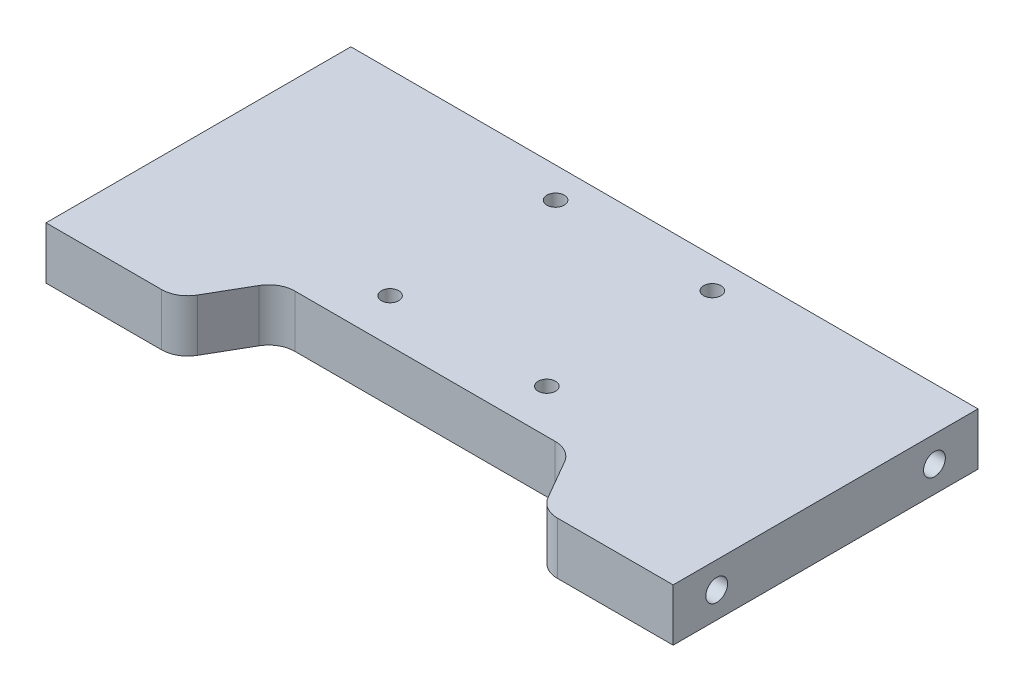
ISO-10303-21;
HEADER;
FILE_DESCRIPTION(('STEP AP214'),'2;1');
FILE_NAME('part.step','',(''),(''),'','','');
FILE_SCHEMA(('AUTOMOTIVE_DESIGN { 1 0 10303 214 1 1 1 1 }'));
ENDSEC;
DATA;
#1=APPLICATION_CONTEXT('core data for automotive mechanical design processes');
#2=APPLICATION_PROTOCOL_DEFINITION('international standard','automotive_design',2000,#1);
#3=PRODUCT_CONTEXT('',#1,'mechanical');
#4=PRODUCT('Part','Part','',(#3));
#5=PRODUCT_RELATED_PRODUCT_CATEGORY('part','',(#4));
#6=PRODUCT_DEFINITION_FORMATION('','',#4);
#7=PRODUCT_DEFINITION_CONTEXT('part definition',#1,'design');
#8=PRODUCT_DEFINITION('design','',#6,#7);
#9=PRODUCT_DEFINITION_SHAPE('','',#8);
#10=(LENGTH_UNIT() NAMED_UNIT(*) SI_UNIT(.MILLI.,.METRE.));
#11=(NAMED_UNIT(*) PLANE_ANGLE_UNIT() SI_UNIT($,.RADIAN.));
#12=(NAMED_UNIT(*) SI_UNIT($,.STERADIAN.) SOLID_ANGLE_UNIT());
#13=UNCERTAINTY_MEASURE_WITH_UNIT(LENGTH_MEASURE(1.E-05),#10,'distance_accuracy_value','');
#14=(GEOMETRIC_REPRESENTATION_CONTEXT(3) GLOBAL_UNCERTAINTY_ASSIGNED_CONTEXT((#13)) GLOBAL_UNIT_ASSIGNED_CONTEXT((#10,
#11,#12)) REPRESENTATION_CONTEXT('',''));
#15=CARTESIAN_POINT('',(0.,0.,0.));
#16=DIRECTION('',(0.,0.,1.));
#17=DIRECTION('',(1.,0.,0.));
#18=AXIS2_PLACEMENT_3D('',#15,#16,#17);
#19=CARTESIAN_POINT('',(0.,6.,0.));
#20=DIRECTION('',(0.,0.,-1.));
#21=DIRECTION('',(-1.,0.,0.));
#22=AXIS2_PLACEMENT_3D('',#19,#20,#21);
#23=PLANE('',#22);
#24=DIRECTION('',(1.,0.,0.));
#25=VECTOR('',#24,1.);
#26=CARTESIAN_POINT('',(0.,0.,0.));
#27=LINE('',#26,#25);
#28=CARTESIAN_POINT('',(0.,0.,0.));
#29=VERTEX_POINT('',#28);
#30=CARTESIAN_POINT('',(13.2679491924311,0.,0.));
#31=VERTEX_POINT('',#30);
#32=EDGE_CURVE('E221',#29,#31,#27,.T.);
#33=ORIENTED_EDGE('',*,*,#32,.T.);
#34=DIRECTION('',(0.,1.,0.));
#35=VECTOR('',#34,1.);
#36=CARTESIAN_POINT('',(13.2679491924311,6.,0.));
#37=LINE('',#36,#35);
#38=CARTESIAN_POINT('',(13.2679491924311,6.,0.));
#39=VERTEX_POINT('',#38);
#40=EDGE_CURVE('E262',#31,#39,#37,.T.);
#41=ORIENTED_EDGE('',*,*,#40,.T.);
#42=DIRECTION('',(1.,0.,0.));
#43=VECTOR('',#42,1.);
#44=CARTESIAN_POINT('',(0.,6.,0.));
#45=LINE('',#44,#43);
#46=CARTESIAN_POINT('',(0.,6.,0.));
#47=VERTEX_POINT('',#46);
#48=EDGE_CURVE('E210',#47,#39,#45,.T.);
#49=ORIENTED_EDGE('',*,*,#48,.F.);
#50=DIRECTION('',(0.,-1.,0.));
#51=VECTOR('',#50,1.);
#52=CARTESIAN_POINT('',(0.,6.,0.));
#53=LINE('',#52,#51);
#54=EDGE_CURVE('E235',#47,#29,#53,.T.);
#55=ORIENTED_EDGE('',*,*,#54,.T.);
#56=EDGE_LOOP('',(#33,#41,#49,#55));
#57=FACE_BOUND('',#56,.T.);
#58=ADVANCED_FACE('F32',(#57),#23,.F.);
#59=CARTESIAN_POINT('',(0.,6.,0.));
#60=DIRECTION('',(1.,0.,0.));
#61=DIRECTION('',(0.,0.,-1.));
#62=AXIS2_PLACEMENT_3D('',#59,#60,#61);
#63=PLANE('',#62);
#64=CARTESIAN_POINT('',(0.,3.,-30.));
#65=DIRECTION('',(-1.,0.,0.));
#66=DIRECTION('',(0.,0.,1.));
#67=AXIS2_PLACEMENT_3D('',#64,#65,#66);
#68=CIRCLE('',#67,1.25);
#69=CARTESIAN_POINT('',(0.,3.,-28.75));
#70=VERTEX_POINT('',#69);
#71=EDGE_CURVE('E153',#70,#70,#68,.T.);
#72=ORIENTED_EDGE('',*,*,#71,.F.);
#73=EDGE_LOOP('',(#72));
#74=FACE_BOUND('',#73,.T.);
#75=CARTESIAN_POINT('',(0.,3.,-5.));
#76=DIRECTION('',(-1.,0.,0.));
#77=DIRECTION('',(0.,0.,1.));
#78=AXIS2_PLACEMENT_3D('',#75,#76,#77);
#79=CIRCLE('',#78,1.25);
#80=CARTESIAN_POINT('',(0.,3.,-3.75));
#81=VERTEX_POINT('',#80);
#82=EDGE_CURVE('E159',#81,#81,#79,.T.);
#83=ORIENTED_EDGE('',*,*,#82,.F.);
#84=EDGE_LOOP('',(#83));
#85=FACE_BOUND('',#84,.T.);
#86=DIRECTION('',(0.,0.,1.));
#87=VECTOR('',#86,1.);
#88=CARTESIAN_POINT('',(0.,0.,0.));
#89=LINE('',#88,#87);
#90=CARTESIAN_POINT('',(0.,0.,-35.));
#91=VERTEX_POINT('',#90);
#92=EDGE_CURVE('E204',#91,#29,#89,.T.);
#93=ORIENTED_EDGE('',*,*,#92,.T.);
#94=ORIENTED_EDGE('',*,*,#54,.F.);
#95=DIRECTION('',(0.,0.,1.));
#96=VECTOR('',#95,1.);
#97=CARTESIAN_POINT('',(0.,6.,0.));
#98=LINE('',#97,#96);
#99=CARTESIAN_POINT('',(0.,6.,-35.));
#100=VERTEX_POINT('',#99);
#101=EDGE_CURVE('E205',#100,#47,#98,.T.);
#102=ORIENTED_EDGE('',*,*,#101,.F.);
#103=DIRECTION('',(0.,-1.,0.));
#104=VECTOR('',#103,1.);
#105=CARTESIAN_POINT('',(0.,6.,-35.));
#106=LINE('',#105,#104);
#107=EDGE_CURVE('E217',#100,#91,#106,.T.);
#108=ORIENTED_EDGE('',*,*,#107,.T.);
#109=EDGE_LOOP('',(#93,#94,#102,#108));
#110=FACE_BOUND('',#109,.T.);
#111=ADVANCED_FACE('F292',(#74,#85,#110),#63,.F.);
#112=CARTESIAN_POINT('',(58.7320508075689,6.,0.));
#113=VERTEX_POINT('',#112);
#114=CARTESIAN_POINT('',(72.,6.,0.));
#115=VERTEX_POINT('',#114);
#116=EDGE_CURVE('E208',#113,#115,#45,.T.);
#117=ORIENTED_EDGE('',*,*,#116,.F.);
#118=DIRECTION('',(0.,1.,0.));
#119=VECTOR('',#118,1.);
#120=CARTESIAN_POINT('',(58.7320508075689,6.,0.));
#121=LINE('',#120,#119);
#122=CARTESIAN_POINT('',(58.7320508075689,0.,0.));
#123=VERTEX_POINT('',#122);
#124=EDGE_CURVE('E247',#113,#123,#121,.F.);
#125=ORIENTED_EDGE('',*,*,#124,.T.);
#126=CARTESIAN_POINT('',(72.,0.,0.));
#127=VERTEX_POINT('',#126);
#128=EDGE_CURVE('E220',#123,#127,#27,.T.);
#129=ORIENTED_EDGE('',*,*,#128,.T.);
#130=DIRECTION('',(0.,-1.,0.));
#131=VECTOR('',#130,1.);
#132=CARTESIAN_POINT('',(72.,6.,0.));
#133=LINE('',#132,#131);
#134=EDGE_CURVE('E232',#115,#127,#133,.T.);
#135=ORIENTED_EDGE('',*,*,#134,.F.);
#136=EDGE_LOOP('',(#117,#125,#129,#135));
#137=FACE_BOUND('',#136,.T.);
#138=ADVANCED_FACE('F306',(#137),#23,.F.);
#139=CARTESIAN_POINT('',(72.,6.,0.));
#140=DIRECTION('',(-1.,0.,0.));
#141=DIRECTION('',(0.,0.,1.));
#142=AXIS2_PLACEMENT_3D('',#139,#140,#141);
#143=PLANE('',#142);
#144=CARTESIAN_POINT('',(72.,3.,-5.));
#145=DIRECTION('',(1.,0.,0.));
#146=DIRECTION('',(0.,0.,-1.));
#147=AXIS2_PLACEMENT_3D('',#144,#145,#146);
#148=CIRCLE('',#147,1.25);
#149=CARTESIAN_POINT('',(72.,3.,-6.25));
#150=VERTEX_POINT('',#149);
#151=EDGE_CURVE('E143',#150,#150,#148,.T.);
#152=ORIENTED_EDGE('',*,*,#151,.F.);
#153=EDGE_LOOP('',(#152));
#154=FACE_BOUND('',#153,.T.);
#155=CARTESIAN_POINT('',(72.,3.,-30.));
#156=DIRECTION('',(1.,0.,0.));
#157=DIRECTION('',(0.,0.,-1.));
#158=AXIS2_PLACEMENT_3D('',#155,#156,#157);
#159=CIRCLE('',#158,1.25);
#160=CARTESIAN_POINT('',(72.,3.,-31.25));
#161=VERTEX_POINT('',#160);
#162=EDGE_CURVE('E142',#161,#161,#159,.T.);
#163=ORIENTED_EDGE('',*,*,#162,.F.);
#164=EDGE_LOOP('',(#163));
#165=FACE_BOUND('',#164,.T.);
#166=DIRECTION('',(0.,0.,-1.));
#167=VECTOR('',#166,1.);
#168=CARTESIAN_POINT('',(72.,0.,0.));
#169=LINE('',#168,#167);
#170=CARTESIAN_POINT('',(72.,0.,-35.));
#171=VERTEX_POINT('',#170);
#172=EDGE_CURVE('E224',#127,#171,#169,.T.);
#173=ORIENTED_EDGE('',*,*,#172,.T.);
#174=DIRECTION('',(0.,-1.,0.));
#175=VECTOR('',#174,1.);
#176=CARTESIAN_POINT('',(72.,6.,-35.));
#177=LINE('',#176,#175);
#178=CARTESIAN_POINT('',(72.,6.,-35.));
#179=VERTEX_POINT('',#178);
#180=EDGE_CURVE('E229',#179,#171,#177,.T.);
#181=ORIENTED_EDGE('',*,*,#180,.F.);
#182=DIRECTION('',(0.,0.,-1.));
#183=VECTOR('',#182,1.);
#184=CARTESIAN_POINT('',(72.,6.,0.));
#185=LINE('',#184,#183);
#186=EDGE_CURVE('E213',#115,#179,#185,.T.);
#187=ORIENTED_EDGE('',*,*,#186,.F.);
#188=ORIENTED_EDGE('',*,*,#134,.T.);
#189=EDGE_LOOP('',(#173,#181,#187,#188));
#190=FACE_BOUND('',#189,.T.);
#191=ADVANCED_FACE('F302',(#154,#165,#190),#143,.F.);
#192=CARTESIAN_POINT('',(0.,6.,-35.));
#193=DIRECTION('',(0.,0.,1.));
#194=DIRECTION('',(1.,0.,0.));
#195=AXIS2_PLACEMENT_3D('',#192,#193,#194);
#196=PLANE('',#195);
#197=DIRECTION('',(-1.,0.,0.));
#198=VECTOR('',#197,1.);
#199=CARTESIAN_POINT('',(0.,0.,-35.));
#200=LINE('',#199,#198);
#201=EDGE_CURVE('E209',#171,#91,#200,.T.);
#202=ORIENTED_EDGE('',*,*,#201,.T.);
#203=ORIENTED_EDGE('',*,*,#107,.F.);
#204=DIRECTION('',(-1.,0.,0.));
#205=VECTOR('',#204,1.);
#206=CARTESIAN_POINT('',(0.,6.,-35.));
#207=LINE('',#206,#205);
#208=EDGE_CURVE('E215',#179,#100,#207,.T.);
#209=ORIENTED_EDGE('',*,*,#208,.F.);
#210=ORIENTED_EDGE('',*,*,#180,.T.);
#211=EDGE_LOOP('',(#202,#203,#209,#210));
#212=FACE_BOUND('',#211,.T.);
#213=ADVANCED_FACE('F297',(#212),#196,.F.);
#214=CARTESIAN_POINT('',(0.,6.,0.));
#215=DIRECTION('',(0.,-1.,0.));
#216=DIRECTION('',(0.,0.,-1.));
#217=AXIS2_PLACEMENT_3D('',#214,#215,#216);
#218=PLANE('',#217);
#219=CARTESIAN_POINT('',(27.,6.,-31.5));
#220=DIRECTION('',(0.,1.,0.));
#221=DIRECTION('',(0.,0.,1.));
#222=AXIS2_PLACEMENT_3D('',#219,#220,#221);
#223=CIRCLE('',#222,1.);
#224=CARTESIAN_POINT('',(27.,6.,-30.5));
#225=VERTEX_POINT('',#224);
#226=EDGE_CURVE('E166',#225,#225,#223,.T.);
#227=ORIENTED_EDGE('',*,*,#226,.F.);
#228=EDGE_LOOP('',(#227));
#229=FACE_BOUND('',#228,.T.);
#230=CARTESIAN_POINT('',(45.,6.,-31.5));
#231=DIRECTION('',(0.,1.,0.));
#232=DIRECTION('',(0.,0.,1.));
#233=AXIS2_PLACEMENT_3D('',#230,#231,#232);
#234=CIRCLE('',#233,0.999999999999998);
#235=CARTESIAN_POINT('',(45.,6.,-30.5));
#236=VERTEX_POINT('',#235);
#237=EDGE_CURVE('E172',#236,#236,#234,.T.);
#238=ORIENTED_EDGE('',*,*,#237,.F.);
#239=EDGE_LOOP('',(#238));
#240=FACE_BOUND('',#239,.T.);
#241=CARTESIAN_POINT('',(45.,6.,-12.5));
#242=DIRECTION('',(0.,1.,0.));
#243=DIRECTION('',(0.,0.,1.));
#244=AXIS2_PLACEMENT_3D('',#241,#242,#243);
#245=CIRCLE('',#244,0.999999999999998);
#246=CARTESIAN_POINT('',(45.,6.,-11.5));
#247=VERTEX_POINT('',#246);
#248=EDGE_CURVE('E178',#247,#247,#245,.T.);
#249=ORIENTED_EDGE('',*,*,#248,.F.);
#250=EDGE_LOOP('',(#249));
#251=FACE_BOUND('',#250,.T.);
#252=CARTESIAN_POINT('',(27.,6.,-12.5));
#253=DIRECTION('',(0.,1.,0.));
#254=DIRECTION('',(0.,0.,1.));
#255=AXIS2_PLACEMENT_3D('',#252,#253,#254);
#256=CIRCLE('',#255,1.);
#257=CARTESIAN_POINT('',(27.,6.,-11.5));
#258=VERTEX_POINT('',#257);
#259=EDGE_CURVE('E184',#258,#258,#256,.T.);
#260=ORIENTED_EDGE('',*,*,#259,.F.);
#261=EDGE_LOOP('',(#260));
#262=FACE_BOUND('',#261,.T.);
#263=DIRECTION('',(-0.499999999999998,0.,-0.86602540378444));
#264=VECTOR('',#263,1.);
#265=CARTESIAN_POINT('',(52.6698729810778,6.,-7.5));
#266=LINE('',#265,#264);
#267=CARTESIAN_POINT('',(56.1339745962156,6.,-1.50000000000001));
#268=VERTEX_POINT('',#267);
#269=CARTESIAN_POINT('',(53.5358983848623,6.,-5.99999999999999));
#270=VERTEX_POINT('',#269);
#271=EDGE_CURVE('E199',#268,#270,#266,.T.);
#272=ORIENTED_EDGE('',*,*,#271,.F.);
#273=CARTESIAN_POINT('',(58.7320508075689,6.,-3.));
#274=DIRECTION('',(0.,-1.,0.));
#275=DIRECTION('',(0.,0.,-1.));
#276=AXIS2_PLACEMENT_3D('',#273,#274,#275);
#277=CIRCLE('',#276,3.);
#278=EDGE_CURVE('E245',#268,#113,#277,.F.);
#279=ORIENTED_EDGE('',*,*,#278,.T.);
#280=ORIENTED_EDGE('',*,*,#116,.T.);
#281=ORIENTED_EDGE('',*,*,#186,.T.);
#282=ORIENTED_EDGE('',*,*,#208,.T.);
#283=ORIENTED_EDGE('',*,*,#101,.T.);
#284=ORIENTED_EDGE('',*,*,#48,.T.);
#285=CARTESIAN_POINT('',(13.2679491924311,6.,-3.));
#286=DIRECTION('',(0.,-1.,0.));
#287=DIRECTION('',(0.,0.,-1.));
#288=AXIS2_PLACEMENT_3D('',#285,#286,#287);
#289=CIRCLE('',#288,3.);
#290=CARTESIAN_POINT('',(15.8660254037844,6.,-1.50000000000001));
#291=VERTEX_POINT('',#290);
#292=EDGE_CURVE('E243',#39,#291,#289,.F.);
#293=ORIENTED_EDGE('',*,*,#292,.T.);
#294=DIRECTION('',(-0.499999999999998,0.,0.86602540378444));
#295=VECTOR('',#294,1.);
#296=CARTESIAN_POINT('',(15.,6.,0.));
#297=LINE('',#296,#295);
#298=CARTESIAN_POINT('',(18.4641016151377,6.,-5.99999999999999));
#299=VERTEX_POINT('',#298);
#300=EDGE_CURVE('E196',#299,#291,#297,.T.);
#301=ORIENTED_EDGE('',*,*,#300,.F.);
#302=CARTESIAN_POINT('',(21.0621778264911,6.,-4.5));
#303=DIRECTION('',(0.,-1.,0.));
#304=DIRECTION('',(0.,0.,-1.));
#305=AXIS2_PLACEMENT_3D('',#302,#303,#304);
#306=CIRCLE('',#305,3.);
#307=CARTESIAN_POINT('',(21.0621778264911,6.,-7.5));
#308=VERTEX_POINT('',#307);
#309=EDGE_CURVE('E40',#299,#308,#306,.T.);
#310=ORIENTED_EDGE('',*,*,#309,.T.);
#311=DIRECTION('',(-1.,0.,0.));
#312=VECTOR('',#311,1.);
#313=CARTESIAN_POINT('',(19.3301270189222,6.,-7.5));
#314=LINE('',#313,#312);
#315=CARTESIAN_POINT('',(50.9378221735089,6.,-7.5));
#316=VERTEX_POINT('',#315);
#317=EDGE_CURVE('E202',#316,#308,#314,.T.);
#318=ORIENTED_EDGE('',*,*,#317,.F.);
#319=CARTESIAN_POINT('',(50.9378221735089,6.,-4.5));
#320=DIRECTION('',(0.,-1.,0.));
#321=DIRECTION('',(0.,0.,-1.));
#322=AXIS2_PLACEMENT_3D('',#319,#320,#321);
#323=CIRCLE('',#322,3.);
#324=EDGE_CURVE('E265',#316,#270,#323,.T.);
#325=ORIENTED_EDGE('',*,*,#324,.T.);
#326=EDGE_LOOP('',(#272,#279,#280,#281,#282,#283,#284,#293,#301,#310,#318,#325));
#327=FACE_BOUND('',#326,.T.);
#328=ADVANCED_FACE('F271',(#229,#240,#251,#262,#327),#218,.F.);
#329=CARTESIAN_POINT('',(0.,0.,0.));
#330=DIRECTION('',(0.,-1.,0.));
#331=DIRECTION('',(0.,0.,-1.));
#332=AXIS2_PLACEMENT_3D('',#329,#330,#331);
#333=PLANE('',#332);
#334=CARTESIAN_POINT('',(27.,0.,-31.5));
#335=DIRECTION('',(0.,-1.,0.));
#336=DIRECTION('',(0.,0.,-1.));
#337=AXIS2_PLACEMENT_3D('',#334,#335,#336);
#338=CIRCLE('',#337,1.);
#339=CARTESIAN_POINT('',(27.,0.,-30.5));
#340=VERTEX_POINT('',#339);
#341=EDGE_CURVE('E165',#340,#340,#338,.F.);
#342=ORIENTED_EDGE('',*,*,#341,.T.);
#343=EDGE_LOOP('',(#342));
#344=FACE_BOUND('',#343,.T.);
#345=CARTESIAN_POINT('',(45.,0.,-31.5));
#346=DIRECTION('',(0.,-1.,0.));
#347=DIRECTION('',(0.,0.,-1.));
#348=AXIS2_PLACEMENT_3D('',#345,#346,#347);
#349=CIRCLE('',#348,0.999999999999998);
#350=CARTESIAN_POINT('',(45.,0.,-30.5));
#351=VERTEX_POINT('',#350);
#352=EDGE_CURVE('E169',#351,#351,#349,.F.);
#353=ORIENTED_EDGE('',*,*,#352,.T.);
#354=EDGE_LOOP('',(#353));
#355=FACE_BOUND('',#354,.T.);
#356=CARTESIAN_POINT('',(45.,0.,-12.5));
#357=DIRECTION('',(0.,-1.,0.));
#358=DIRECTION('',(0.,0.,-1.));
#359=AXIS2_PLACEMENT_3D('',#356,#357,#358);
#360=CIRCLE('',#359,0.999999999999998);
#361=CARTESIAN_POINT('',(45.,0.,-11.5));
#362=VERTEX_POINT('',#361);
#363=EDGE_CURVE('E175',#362,#362,#360,.F.);
#364=ORIENTED_EDGE('',*,*,#363,.T.);
#365=EDGE_LOOP('',(#364));
#366=FACE_BOUND('',#365,.T.);
#367=CARTESIAN_POINT('',(27.,0.,-12.5));
#368=DIRECTION('',(0.,-1.,0.));
#369=DIRECTION('',(0.,0.,-1.));
#370=AXIS2_PLACEMENT_3D('',#367,#368,#369);
#371=CIRCLE('',#370,1.);
#372=CARTESIAN_POINT('',(27.,0.,-11.5));
#373=VERTEX_POINT('',#372);
#374=EDGE_CURVE('E181',#373,#373,#371,.F.);
#375=ORIENTED_EDGE('',*,*,#374,.T.);
#376=EDGE_LOOP('',(#375));
#377=FACE_BOUND('',#376,.T.);
#378=ORIENTED_EDGE('',*,*,#128,.F.);
#379=CARTESIAN_POINT('',(58.7320508075689,0.,-3.));
#380=DIRECTION('',(0.,-1.,0.));
#381=DIRECTION('',(0.,0.,-1.));
#382=AXIS2_PLACEMENT_3D('',#379,#380,#381);
#383=CIRCLE('',#382,3.);
#384=CARTESIAN_POINT('',(56.1339745962156,0.,-1.5));
#385=VERTEX_POINT('',#384);
#386=EDGE_CURVE('E251',#123,#385,#383,.T.);
#387=ORIENTED_EDGE('',*,*,#386,.T.);
#388=DIRECTION('',(-0.499999999999998,0.,-0.86602540378444));
#389=VECTOR('',#388,1.);
#390=CARTESIAN_POINT('',(52.6698729810778,0.,-7.5));
#391=LINE('',#390,#389);
#392=CARTESIAN_POINT('',(53.5358983848623,0.,-5.99999999999999));
#393=VERTEX_POINT('',#392);
#394=EDGE_CURVE('E187',#385,#393,#391,.T.);
#395=ORIENTED_EDGE('',*,*,#394,.T.);
#396=CARTESIAN_POINT('',(50.9378221735089,0.,-4.5));
#397=DIRECTION('',(0.,-1.,0.));
#398=DIRECTION('',(0.,0.,-1.));
#399=AXIS2_PLACEMENT_3D('',#396,#397,#398);
#400=CIRCLE('',#399,3.);
#401=CARTESIAN_POINT('',(50.9378221735089,0.,-7.5));
#402=VERTEX_POINT('',#401);
#403=EDGE_CURVE('E54',#393,#402,#400,.F.);
#404=ORIENTED_EDGE('',*,*,#403,.T.);
#405=DIRECTION('',(-1.,0.,0.));
#406=VECTOR('',#405,1.);
#407=CARTESIAN_POINT('',(19.3301270189222,0.,-7.5));
#408=LINE('',#407,#406);
#409=CARTESIAN_POINT('',(21.0621778264911,0.,-7.5));
#410=VERTEX_POINT('',#409);
#411=EDGE_CURVE('E191',#402,#410,#408,.T.);
#412=ORIENTED_EDGE('',*,*,#411,.T.);
#413=CARTESIAN_POINT('',(21.0621778264911,0.,-4.5));
#414=DIRECTION('',(0.,-1.,0.));
#415=DIRECTION('',(0.,0.,-1.));
#416=AXIS2_PLACEMENT_3D('',#413,#414,#415);
#417=CIRCLE('',#416,3.);
#418=CARTESIAN_POINT('',(18.4641016151377,0.,-6.));
#419=VERTEX_POINT('',#418);
#420=EDGE_CURVE('E11',#410,#419,#417,.F.);
#421=ORIENTED_EDGE('',*,*,#420,.T.);
#422=DIRECTION('',(-0.499999999999998,0.,0.86602540378444));
#423=VECTOR('',#422,1.);
#424=CARTESIAN_POINT('',(15.,0.,0.));
#425=LINE('',#424,#423);
#426=CARTESIAN_POINT('',(15.8660254037844,0.,-1.50000000000001));
#427=VERTEX_POINT('',#426);
#428=EDGE_CURVE('E193',#419,#427,#425,.T.);
#429=ORIENTED_EDGE('',*,*,#428,.T.);
#430=CARTESIAN_POINT('',(13.2679491924311,0.,-3.));
#431=DIRECTION('',(0.,-1.,0.));
#432=DIRECTION('',(0.,0.,-1.));
#433=AXIS2_PLACEMENT_3D('',#430,#431,#432);
#434=CIRCLE('',#433,3.);
#435=EDGE_CURVE('E249',#427,#31,#434,.T.);
#436=ORIENTED_EDGE('',*,*,#435,.T.);
#437=ORIENTED_EDGE('',*,*,#32,.F.);
#438=ORIENTED_EDGE('',*,*,#92,.F.);
#439=ORIENTED_EDGE('',*,*,#201,.F.);
#440=ORIENTED_EDGE('',*,*,#172,.F.);
#441=EDGE_LOOP('',(#378,#387,#395,#404,#412,#421,#429,#436,#437,#438,#439,#440));
#442=FACE_BOUND('',#441,.T.);
#443=ADVANCED_FACE('F280',(#344,#355,#366,#377,#442),#333,.T.);
#444=CARTESIAN_POINT('',(15.,-0.00100000000000013,0.));
#445=DIRECTION('',(-0.86602540378444,0.,-0.499999999999998));
#446=DIRECTION('',(-0.499999999999998,0.,0.86602540378444));
#447=AXIS2_PLACEMENT_3D('',#444,#445,#446);
#448=PLANE('',#447);
#449=ORIENTED_EDGE('',*,*,#428,.F.);
#450=DIRECTION('',(0.,1.,0.));
#451=VECTOR('',#450,1.);
#452=CARTESIAN_POINT('',(18.4641016151377,6.,-5.99999999999999));
#453=LINE('',#452,#451);
#454=EDGE_CURVE('E259',#419,#299,#453,.T.);
#455=ORIENTED_EDGE('',*,*,#454,.T.);
#456=ORIENTED_EDGE('',*,*,#300,.T.);
#457=DIRECTION('',(0.,1.,0.));
#458=VECTOR('',#457,1.);
#459=CARTESIAN_POINT('',(15.8660254037844,-0.00100000000000013,-1.50000000000001));
#460=LINE('',#459,#458);
#461=EDGE_CURVE('E257',#291,#427,#460,.F.);
#462=ORIENTED_EDGE('',*,*,#461,.T.);
#463=EDGE_LOOP('',(#449,#455,#456,#462));
#464=FACE_BOUND('',#463,.T.);
#465=ADVANCED_FACE('F283',(#464),#448,.F.);
#466=CARTESIAN_POINT('',(19.3301270189222,-0.00100000000000013,-7.5));
#467=DIRECTION('',(0.,0.,-1.));
#468=DIRECTION('',(-1.,0.,0.));
#469=AXIS2_PLACEMENT_3D('',#466,#467,#468);
#470=PLANE('',#469);
#471=ORIENTED_EDGE('',*,*,#411,.F.);
#472=DIRECTION('',(0.,1.,0.));
#473=VECTOR('',#472,1.);
#474=CARTESIAN_POINT('',(50.9378221735089,6.,-7.5));
#475=LINE('',#474,#473);
#476=EDGE_CURVE('E254',#402,#316,#475,.T.);
#477=ORIENTED_EDGE('',*,*,#476,.T.);
#478=ORIENTED_EDGE('',*,*,#317,.T.);
#479=DIRECTION('',(0.,1.,0.));
#480=VECTOR('',#479,1.);
#481=CARTESIAN_POINT('',(21.0621778264911,0.,-7.5));
#482=LINE('',#481,#480);
#483=EDGE_CURVE('E47',#308,#410,#482,.F.);
#484=ORIENTED_EDGE('',*,*,#483,.T.);
#485=EDGE_LOOP('',(#471,#477,#478,#484));
#486=FACE_BOUND('',#485,.T.);
#487=ADVANCED_FACE('F274',(#486),#470,.F.);
#488=CARTESIAN_POINT('',(52.6698729810778,-0.00100000000000013,-7.5));
#489=DIRECTION('',(0.86602540378444,0.,-0.499999999999998));
#490=DIRECTION('',(-0.499999999999998,0.,-0.86602540378444));
#491=AXIS2_PLACEMENT_3D('',#488,#489,#490);
#492=PLANE('',#491);
#493=ORIENTED_EDGE('',*,*,#394,.F.);
#494=DIRECTION('',(0.,1.,0.));
#495=VECTOR('',#494,1.);
#496=CARTESIAN_POINT('',(56.1339745962156,-0.00100000000000013,-1.50000000000001));
#497=LINE('',#496,#495);
#498=EDGE_CURVE('E240',#385,#268,#497,.T.);
#499=ORIENTED_EDGE('',*,*,#498,.T.);
#500=ORIENTED_EDGE('',*,*,#271,.T.);
#501=DIRECTION('',(0.,1.,0.));
#502=VECTOR('',#501,1.);
#503=CARTESIAN_POINT('',(53.5358983848623,0.,-5.99999999999999));
#504=LINE('',#503,#502);
#505=EDGE_CURVE('E238',#270,#393,#504,.F.);
#506=ORIENTED_EDGE('',*,*,#505,.T.);
#507=EDGE_LOOP('',(#493,#499,#500,#506));
#508=FACE_BOUND('',#507,.T.);
#509=ADVANCED_FACE('F314',(#508),#492,.F.);
#510=CARTESIAN_POINT('',(27.,-0.00100000000000013,-12.5));
#511=DIRECTION('',(0.,1.,0.));
#512=DIRECTION('',(0.,0.,1.));
#513=AXIS2_PLACEMENT_3D('',#510,#511,#512);
#514=CYLINDRICAL_SURFACE('',#513,1.);
#515=CARTESIAN_POINT('',(27.,0.,-11.5));
#516=CARTESIAN_POINT('',(27.,0.0624999999999999,-11.5));
#517=CARTESIAN_POINT('',(27.,0.125,-11.5));
#518=CARTESIAN_POINT('',(27.,0.25,-11.5));
#519=CARTESIAN_POINT('',(27.,0.3125,-11.5));
#520=CARTESIAN_POINT('',(27.,0.4375,-11.5));
#521=CARTESIAN_POINT('',(27.,0.5,-11.5));
#522=CARTESIAN_POINT('',(27.,0.625,-11.5));
#523=CARTESIAN_POINT('',(27.,0.6875,-11.5));
#524=CARTESIAN_POINT('',(27.,0.8125,-11.5));
#525=CARTESIAN_POINT('',(27.,0.875,-11.5));
#526=CARTESIAN_POINT('',(27.,1.,-11.5));
#527=CARTESIAN_POINT('',(27.,1.0625,-11.5));
#528=CARTESIAN_POINT('',(27.,1.1875,-11.5));
#529=CARTESIAN_POINT('',(27.,1.25,-11.5));
#530=CARTESIAN_POINT('',(27.,1.375,-11.5));
#531=CARTESIAN_POINT('',(27.,1.4375,-11.5));
#532=CARTESIAN_POINT('',(27.,1.5625,-11.5));
#533=CARTESIAN_POINT('',(27.,1.625,-11.5));
#534=CARTESIAN_POINT('',(27.,1.75,-11.5));
#535=CARTESIAN_POINT('',(27.,1.8125,-11.5));
#536=CARTESIAN_POINT('',(27.,1.9375,-11.5));
#537=CARTESIAN_POINT('',(27.,2.,-11.5));
#538=CARTESIAN_POINT('',(27.,2.125,-11.5));
#539=CARTESIAN_POINT('',(27.,2.1875,-11.5));
#540=CARTESIAN_POINT('',(27.,2.3125,-11.5));
#541=CARTESIAN_POINT('',(27.,2.375,-11.5));
#542=CARTESIAN_POINT('',(27.,2.5,-11.5));
#543=CARTESIAN_POINT('',(27.,2.5625,-11.5));
#544=CARTESIAN_POINT('',(27.,2.6875,-11.5));
#545=CARTESIAN_POINT('',(27.,2.75,-11.5));
#546=CARTESIAN_POINT('',(27.,2.875,-11.5));
#547=CARTESIAN_POINT('',(27.,2.9375,-11.5));
#548=CARTESIAN_POINT('',(27.,3.0625,-11.5));
#549=CARTESIAN_POINT('',(27.,3.125,-11.5));
#550=CARTESIAN_POINT('',(27.,3.25,-11.5));
#551=CARTESIAN_POINT('',(27.,3.3125,-11.5));
#552=CARTESIAN_POINT('',(27.,3.4375,-11.5));
#553=CARTESIAN_POINT('',(27.,3.5,-11.5));
#554=CARTESIAN_POINT('',(27.,3.625,-11.5));
#555=CARTESIAN_POINT('',(27.,3.6875,-11.5));
#556=CARTESIAN_POINT('',(27.,3.8125,-11.5));
#557=CARTESIAN_POINT('',(27.,3.875,-11.5));
#558=CARTESIAN_POINT('',(27.,4.,-11.5));
#559=CARTESIAN_POINT('',(27.,4.0625,-11.5));
#560=CARTESIAN_POINT('',(27.,4.1875,-11.5));
#561=CARTESIAN_POINT('',(27.,4.25,-11.5));
#562=CARTESIAN_POINT('',(27.,4.375,-11.5));
#563=CARTESIAN_POINT('',(27.,4.4375,-11.5));
#564=CARTESIAN_POINT('',(27.,4.5625,-11.5));
#565=CARTESIAN_POINT('',(27.,4.625,-11.5));
#566=CARTESIAN_POINT('',(27.,4.75,-11.5));
#567=CARTESIAN_POINT('',(27.,4.8125,-11.5));
#568=CARTESIAN_POINT('',(27.,4.9375,-11.5));
#569=CARTESIAN_POINT('',(27.,5.,-11.5));
#570=CARTESIAN_POINT('',(27.,5.125,-11.5));
#571=CARTESIAN_POINT('',(27.,5.1875,-11.5));
#572=CARTESIAN_POINT('',(27.,5.3125,-11.5));
#573=CARTESIAN_POINT('',(27.,5.375,-11.5));
#574=CARTESIAN_POINT('',(27.,5.5,-11.5));
#575=CARTESIAN_POINT('',(27.,5.5625,-11.5));
#576=CARTESIAN_POINT('',(27.,5.6875,-11.5));
#577=CARTESIAN_POINT('',(27.,5.75,-11.5));
#578=CARTESIAN_POINT('',(27.,5.875,-11.5));
#579=CARTESIAN_POINT('',(27.,5.9375,-11.5));
#580=CARTESIAN_POINT('',(27.,6.,-11.5));
#581=B_SPLINE_CURVE_WITH_KNOTS('',3,(#515,#516,#517,#518,#519,#520,#521,#522,#523,#524,#525,
#526,#527,#528,#529,#530,#531,#532,#533,#534,#535,#536,#537,#538,#539,#540,#541,#542,#543,#544,
#545,#546,#547,#548,#549,#550,#551,#552,#553,#554,#555,#556,#557,#558,#559,#560,#561,#562,#563,
#564,#565,#566,#567,#568,#569,#570,#571,#572,#573,#574,#575,#576,#577,#578,#579,#580),
.UNSPECIFIED.,.F.,.F.,(4,2,2,2,2,2,2,2,2,2,2,2,2,2,2,2,2,2,2,2,2,2,2,2,2,2,2,2,2,2,2,2,4),(0.,
0.1875,0.375,0.5625,0.75,0.9375,1.125,1.3125,1.5,1.6875,1.875,2.0625,2.25,2.4375,2.625,2.8125,
3.,3.1875,3.375,3.5625,3.75,3.9375,4.125,4.3125,4.5,4.6875,4.875,5.0625,5.25,5.4375,5.625,
5.8125,6.),.UNSPECIFIED.);
#582=EDGE_CURVE('BSEAM356',#373,#258,#581,.T.);
#583=ORIENTED_EDGE('',*,*,#374,.F.);
#584=ORIENTED_EDGE('',*,*,#259,.T.);
#585=ORIENTED_EDGE('',*,*,#582,.T.);
#586=ORIENTED_EDGE('',*,*,#582,.F.);
#587=EDGE_LOOP('',(#583,#585,#584,#586));
#588=FACE_BOUND('',#587,.T.);
#589=ADVANCED_FACE('F356',(#588),#514,.F.);
#590=CARTESIAN_POINT('',(45.,-0.00100000000000013,-12.5));
#591=DIRECTION('',(0.,1.,0.));
#592=DIRECTION('',(0.,0.,1.));
#593=AXIS2_PLACEMENT_3D('',#590,#591,#592);
#594=CYLINDRICAL_SURFACE('',#593,0.999999999999998);
#595=CARTESIAN_POINT('',(45.,0.,-11.5));
#596=CARTESIAN_POINT('',(45.,0.0624999999999999,-11.5));
#597=CARTESIAN_POINT('',(45.,0.125,-11.5));
#598=CARTESIAN_POINT('',(45.,0.25,-11.5));
#599=CARTESIAN_POINT('',(45.,0.3125,-11.5));
#600=CARTESIAN_POINT('',(45.,0.4375,-11.5));
#601=CARTESIAN_POINT('',(45.,0.5,-11.5));
#602=CARTESIAN_POINT('',(45.,0.625,-11.5));
#603=CARTESIAN_POINT('',(45.,0.6875,-11.5));
#604=CARTESIAN_POINT('',(45.,0.8125,-11.5));
#605=CARTESIAN_POINT('',(45.,0.875,-11.5));
#606=CARTESIAN_POINT('',(45.,1.,-11.5));
#607=CARTESIAN_POINT('',(45.,1.0625,-11.5));
#608=CARTESIAN_POINT('',(45.,1.1875,-11.5));
#609=CARTESIAN_POINT('',(45.,1.25,-11.5));
#610=CARTESIAN_POINT('',(45.,1.375,-11.5));
#611=CARTESIAN_POINT('',(45.,1.4375,-11.5));
#612=CARTESIAN_POINT('',(45.,1.5625,-11.5));
#613=CARTESIAN_POINT('',(45.,1.625,-11.5));
#614=CARTESIAN_POINT('',(45.,1.75,-11.5));
#615=CARTESIAN_POINT('',(45.,1.8125,-11.5));
#616=CARTESIAN_POINT('',(45.,1.9375,-11.5));
#617=CARTESIAN_POINT('',(45.,2.,-11.5));
#618=CARTESIAN_POINT('',(45.,2.125,-11.5));
#619=CARTESIAN_POINT('',(45.,2.1875,-11.5));
#620=CARTESIAN_POINT('',(45.,2.3125,-11.5));
#621=CARTESIAN_POINT('',(45.,2.375,-11.5));
#622=CARTESIAN_POINT('',(45.,2.5,-11.5));
#623=CARTESIAN_POINT('',(45.,2.5625,-11.5));
#624=CARTESIAN_POINT('',(45.,2.6875,-11.5));
#625=CARTESIAN_POINT('',(45.,2.75,-11.5));
#626=CARTESIAN_POINT('',(45.,2.875,-11.5));
#627=CARTESIAN_POINT('',(45.,2.9375,-11.5));
#628=CARTESIAN_POINT('',(45.,3.0625,-11.5));
#629=CARTESIAN_POINT('',(45.,3.125,-11.5));
#630=CARTESIAN_POINT('',(45.,3.25,-11.5));
#631=CARTESIAN_POINT('',(45.,3.3125,-11.5));
#632=CARTESIAN_POINT('',(45.,3.4375,-11.5));
#633=CARTESIAN_POINT('',(45.,3.5,-11.5));
#634=CARTESIAN_POINT('',(45.,3.625,-11.5));
#635=CARTESIAN_POINT('',(45.,3.6875,-11.5));
#636=CARTESIAN_POINT('',(45.,3.8125,-11.5));
#637=CARTESIAN_POINT('',(45.,3.875,-11.5));
#638=CARTESIAN_POINT('',(45.,4.,-11.5));
#639=CARTESIAN_POINT('',(45.,4.0625,-11.5));
#640=CARTESIAN_POINT('',(45.,4.1875,-11.5));
#641=CARTESIAN_POINT('',(45.,4.25,-11.5));
#642=CARTESIAN_POINT('',(45.,4.375,-11.5));
#643=CARTESIAN_POINT('',(45.,4.4375,-11.5));
#644=CARTESIAN_POINT('',(45.,4.5625,-11.5));
#645=CARTESIAN_POINT('',(45.,4.625,-11.5));
#646=CARTESIAN_POINT('',(45.,4.75,-11.5));
#647=CARTESIAN_POINT('',(45.,4.8125,-11.5));
#648=CARTESIAN_POINT('',(45.,4.9375,-11.5));
#649=CARTESIAN_POINT('',(45.,5.,-11.5));
#650=CARTESIAN_POINT('',(45.,5.125,-11.5));
#651=CARTESIAN_POINT('',(45.,5.1875,-11.5));
#652=CARTESIAN_POINT('',(45.,5.3125,-11.5));
#653=CARTESIAN_POINT('',(45.,5.375,-11.5));
#654=CARTESIAN_POINT('',(45.,5.5,-11.5));
#655=CARTESIAN_POINT('',(45.,5.5625,-11.5));
#656=CARTESIAN_POINT('',(45.,5.6875,-11.5));
#657=CARTESIAN_POINT('',(45.,5.75,-11.5));
#658=CARTESIAN_POINT('',(45.,5.875,-11.5));
#659=CARTESIAN_POINT('',(45.,5.9375,-11.5));
#660=CARTESIAN_POINT('',(45.,6.,-11.5));
#661=B_SPLINE_CURVE_WITH_KNOTS('',3,(#595,#596,#597,#598,#599,#600,#601,#602,#603,#604,#605,
#606,#607,#608,#609,#610,#611,#612,#613,#614,#615,#616,#617,#618,#619,#620,#621,#622,#623,#624,
#625,#626,#627,#628,#629,#630,#631,#632,#633,#634,#635,#636,#637,#638,#639,#640,#641,#642,#643,
#644,#645,#646,#647,#648,#649,#650,#651,#652,#653,#654,#655,#656,#657,#658,#659,#660),
.UNSPECIFIED.,.F.,.F.,(4,2,2,2,2,2,2,2,2,2,2,2,2,2,2,2,2,2,2,2,2,2,2,2,2,2,2,2,2,2,2,2,4),(0.,
0.1875,0.375,0.5625,0.75,0.9375,1.125,1.3125,1.5,1.6875,1.875,2.0625,2.25,2.4375,2.625,2.8125,
3.,3.1875,3.375,3.5625,3.75,3.9375,4.125,4.3125,4.5,4.6875,4.875,5.0625,5.25,5.4375,5.625,
5.8125,6.),.UNSPECIFIED.);
#662=EDGE_CURVE('BSEAM361',#362,#247,#661,.T.);
#663=ORIENTED_EDGE('',*,*,#363,.F.);
#664=ORIENTED_EDGE('',*,*,#248,.T.);
#665=ORIENTED_EDGE('',*,*,#662,.T.);
#666=ORIENTED_EDGE('',*,*,#662,.F.);
#667=EDGE_LOOP('',(#663,#665,#664,#666));
#668=FACE_BOUND('',#667,.T.);
#669=ADVANCED_FACE('F361',(#668),#594,.F.);
#670=CARTESIAN_POINT('',(45.,-0.00100000000000013,-31.5));
#671=DIRECTION('',(0.,1.,0.));
#672=DIRECTION('',(0.,0.,1.));
#673=AXIS2_PLACEMENT_3D('',#670,#671,#672);
#674=CYLINDRICAL_SURFACE('',#673,0.999999999999998);
#675=CARTESIAN_POINT('',(45.,0.,-30.5));
#676=CARTESIAN_POINT('',(45.,0.0624999999999999,-30.5));
#677=CARTESIAN_POINT('',(45.,0.125,-30.5));
#678=CARTESIAN_POINT('',(45.,0.25,-30.5));
#679=CARTESIAN_POINT('',(45.,0.3125,-30.5));
#680=CARTESIAN_POINT('',(45.,0.4375,-30.5));
#681=CARTESIAN_POINT('',(45.,0.5,-30.5));
#682=CARTESIAN_POINT('',(45.,0.625,-30.5));
#683=CARTESIAN_POINT('',(45.,0.6875,-30.5));
#684=CARTESIAN_POINT('',(45.,0.8125,-30.5));
#685=CARTESIAN_POINT('',(45.,0.875,-30.5));
#686=CARTESIAN_POINT('',(45.,1.,-30.5));
#687=CARTESIAN_POINT('',(45.,1.0625,-30.5));
#688=CARTESIAN_POINT('',(45.,1.1875,-30.5));
#689=CARTESIAN_POINT('',(45.,1.25,-30.5));
#690=CARTESIAN_POINT('',(45.,1.375,-30.5));
#691=CARTESIAN_POINT('',(45.,1.4375,-30.5));
#692=CARTESIAN_POINT('',(45.,1.5625,-30.5));
#693=CARTESIAN_POINT('',(45.,1.625,-30.5));
#694=CARTESIAN_POINT('',(45.,1.75,-30.5));
#695=CARTESIAN_POINT('',(45.,1.8125,-30.5));
#696=CARTESIAN_POINT('',(45.,1.9375,-30.5));
#697=CARTESIAN_POINT('',(45.,2.,-30.5));
#698=CARTESIAN_POINT('',(45.,2.125,-30.5));
#699=CARTESIAN_POINT('',(45.,2.1875,-30.5));
#700=CARTESIAN_POINT('',(45.,2.3125,-30.5));
#701=CARTESIAN_POINT('',(45.,2.375,-30.5));
#702=CARTESIAN_POINT('',(45.,2.5,-30.5));
#703=CARTESIAN_POINT('',(45.,2.5625,-30.5));
#704=CARTESIAN_POINT('',(45.,2.6875,-30.5));
#705=CARTESIAN_POINT('',(45.,2.75,-30.5));
#706=CARTESIAN_POINT('',(45.,2.875,-30.5));
#707=CARTESIAN_POINT('',(45.,2.9375,-30.5));
#708=CARTESIAN_POINT('',(45.,3.0625,-30.5));
#709=CARTESIAN_POINT('',(45.,3.125,-30.5));
#710=CARTESIAN_POINT('',(45.,3.25,-30.5));
#711=CARTESIAN_POINT('',(45.,3.3125,-30.5));
#712=CARTESIAN_POINT('',(45.,3.4375,-30.5));
#713=CARTESIAN_POINT('',(45.,3.5,-30.5));
#714=CARTESIAN_POINT('',(45.,3.625,-30.5));
#715=CARTESIAN_POINT('',(45.,3.6875,-30.5));
#716=CARTESIAN_POINT('',(45.,3.8125,-30.5));
#717=CARTESIAN_POINT('',(45.,3.875,-30.5));
#718=CARTESIAN_POINT('',(45.,4.,-30.5));
#719=CARTESIAN_POINT('',(45.,4.0625,-30.5));
#720=CARTESIAN_POINT('',(45.,4.1875,-30.5));
#721=CARTESIAN_POINT('',(45.,4.25,-30.5));
#722=CARTESIAN_POINT('',(45.,4.375,-30.5));
#723=CARTESIAN_POINT('',(45.,4.4375,-30.5));
#724=CARTESIAN_POINT('',(45.,4.5625,-30.5));
#725=CARTESIAN_POINT('',(45.,4.625,-30.5));
#726=CARTESIAN_POINT('',(45.,4.75,-30.5));
#727=CARTESIAN_POINT('',(45.,4.8125,-30.5));
#728=CARTESIAN_POINT('',(45.,4.9375,-30.5));
#729=CARTESIAN_POINT('',(45.,5.,-30.5));
#730=CARTESIAN_POINT('',(45.,5.125,-30.5));
#731=CARTESIAN_POINT('',(45.,5.1875,-30.5));
#732=CARTESIAN_POINT('',(45.,5.3125,-30.5));
#733=CARTESIAN_POINT('',(45.,5.375,-30.5));
#734=CARTESIAN_POINT('',(45.,5.5,-30.5));
#735=CARTESIAN_POINT('',(45.,5.5625,-30.5));
#736=CARTESIAN_POINT('',(45.,5.6875,-30.5));
#737=CARTESIAN_POINT('',(45.,5.75,-30.5));
#738=CARTESIAN_POINT('',(45.,5.875,-30.5));
#739=CARTESIAN_POINT('',(45.,5.9375,-30.5));
#740=CARTESIAN_POINT('',(45.,6.,-30.5));
#741=B_SPLINE_CURVE_WITH_KNOTS('',3,(#675,#676,#677,#678,#679,#680,#681,#682,#683,#684,#685,
#686,#687,#688,#689,#690,#691,#692,#693,#694,#695,#696,#697,#698,#699,#700,#701,#702,#703,#704,
#705,#706,#707,#708,#709,#710,#711,#712,#713,#714,#715,#716,#717,#718,#719,#720,#721,#722,#723,
#724,#725,#726,#727,#728,#729,#730,#731,#732,#733,#734,#735,#736,#737,#738,#739,#740),
.UNSPECIFIED.,.F.,.F.,(4,2,2,2,2,2,2,2,2,2,2,2,2,2,2,2,2,2,2,2,2,2,2,2,2,2,2,2,2,2,2,2,4),(0.,
0.1875,0.375,0.5625,0.75,0.9375,1.125,1.3125,1.5,1.6875,1.875,2.0625,2.25,2.4375,2.625,2.8125,
3.,3.1875,3.375,3.5625,3.75,3.9375,4.125,4.3125,4.5,4.6875,4.875,5.0625,5.25,5.4375,5.625,
5.8125,6.),.UNSPECIFIED.);
#742=EDGE_CURVE('BSEAM365',#351,#236,#741,.T.);
#743=ORIENTED_EDGE('',*,*,#352,.F.);
#744=ORIENTED_EDGE('',*,*,#237,.T.);
#745=ORIENTED_EDGE('',*,*,#742,.T.);
#746=ORIENTED_EDGE('',*,*,#742,.F.);
#747=EDGE_LOOP('',(#743,#745,#744,#746));
#748=FACE_BOUND('',#747,.T.);
#749=ADVANCED_FACE('F365',(#748),#674,.F.);
#750=CARTESIAN_POINT('',(27.,-0.00100000000000013,-31.5));
#751=DIRECTION('',(0.,1.,0.));
#752=DIRECTION('',(0.,0.,1.));
#753=AXIS2_PLACEMENT_3D('',#750,#751,#752);
#754=CYLINDRICAL_SURFACE('',#753,1.);
#755=CARTESIAN_POINT('',(27.,0.,-30.5));
#756=CARTESIAN_POINT('',(27.,0.0624999999999999,-30.5));
#757=CARTESIAN_POINT('',(27.,0.125,-30.5));
#758=CARTESIAN_POINT('',(27.,0.25,-30.5));
#759=CARTESIAN_POINT('',(27.,0.3125,-30.5));
#760=CARTESIAN_POINT('',(27.,0.4375,-30.5));
#761=CARTESIAN_POINT('',(27.,0.5,-30.5));
#762=CARTESIAN_POINT('',(27.,0.625,-30.5));
#763=CARTESIAN_POINT('',(27.,0.6875,-30.5));
#764=CARTESIAN_POINT('',(27.,0.8125,-30.5));
#765=CARTESIAN_POINT('',(27.,0.875,-30.5));
#766=CARTESIAN_POINT('',(27.,1.,-30.5));
#767=CARTESIAN_POINT('',(27.,1.0625,-30.5));
#768=CARTESIAN_POINT('',(27.,1.1875,-30.5));
#769=CARTESIAN_POINT('',(27.,1.25,-30.5));
#770=CARTESIAN_POINT('',(27.,1.375,-30.5));
#771=CARTESIAN_POINT('',(27.,1.4375,-30.5));
#772=CARTESIAN_POINT('',(27.,1.5625,-30.5));
#773=CARTESIAN_POINT('',(27.,1.625,-30.5));
#774=CARTESIAN_POINT('',(27.,1.75,-30.5));
#775=CARTESIAN_POINT('',(27.,1.8125,-30.5));
#776=CARTESIAN_POINT('',(27.,1.9375,-30.5));
#777=CARTESIAN_POINT('',(27.,2.,-30.5));
#778=CARTESIAN_POINT('',(27.,2.125,-30.5));
#779=CARTESIAN_POINT('',(27.,2.1875,-30.5));
#780=CARTESIAN_POINT('',(27.,2.3125,-30.5));
#781=CARTESIAN_POINT('',(27.,2.375,-30.5));
#782=CARTESIAN_POINT('',(27.,2.5,-30.5));
#783=CARTESIAN_POINT('',(27.,2.5625,-30.5));
#784=CARTESIAN_POINT('',(27.,2.6875,-30.5));
#785=CARTESIAN_POINT('',(27.,2.75,-30.5));
#786=CARTESIAN_POINT('',(27.,2.875,-30.5));
#787=CARTESIAN_POINT('',(27.,2.9375,-30.5));
#788=CARTESIAN_POINT('',(27.,3.0625,-30.5));
#789=CARTESIAN_POINT('',(27.,3.125,-30.5));
#790=CARTESIAN_POINT('',(27.,3.25,-30.5));
#791=CARTESIAN_POINT('',(27.,3.3125,-30.5));
#792=CARTESIAN_POINT('',(27.,3.4375,-30.5));
#793=CARTESIAN_POINT('',(27.,3.5,-30.5));
#794=CARTESIAN_POINT('',(27.,3.625,-30.5));
#795=CARTESIAN_POINT('',(27.,3.6875,-30.5));
#796=CARTESIAN_POINT('',(27.,3.8125,-30.5));
#797=CARTESIAN_POINT('',(27.,3.875,-30.5));
#798=CARTESIAN_POINT('',(27.,4.,-30.5));
#799=CARTESIAN_POINT('',(27.,4.0625,-30.5));
#800=CARTESIAN_POINT('',(27.,4.1875,-30.5));
#801=CARTESIAN_POINT('',(27.,4.25,-30.5));
#802=CARTESIAN_POINT('',(27.,4.375,-30.5));
#803=CARTESIAN_POINT('',(27.,4.4375,-30.5));
#804=CARTESIAN_POINT('',(27.,4.5625,-30.5));
#805=CARTESIAN_POINT('',(27.,4.625,-30.5));
#806=CARTESIAN_POINT('',(27.,4.75,-30.5));
#807=CARTESIAN_POINT('',(27.,4.8125,-30.5));
#808=CARTESIAN_POINT('',(27.,4.9375,-30.5));
#809=CARTESIAN_POINT('',(27.,5.,-30.5));
#810=CARTESIAN_POINT('',(27.,5.125,-30.5));
#811=CARTESIAN_POINT('',(27.,5.1875,-30.5));
#812=CARTESIAN_POINT('',(27.,5.3125,-30.5));
#813=CARTESIAN_POINT('',(27.,5.375,-30.5));
#814=CARTESIAN_POINT('',(27.,5.5,-30.5));
#815=CARTESIAN_POINT('',(27.,5.5625,-30.5));
#816=CARTESIAN_POINT('',(27.,5.6875,-30.5));
#817=CARTESIAN_POINT('',(27.,5.75,-30.5));
#818=CARTESIAN_POINT('',(27.,5.875,-30.5));
#819=CARTESIAN_POINT('',(27.,5.9375,-30.5));
#820=CARTESIAN_POINT('',(27.,6.,-30.5));
#821=B_SPLINE_CURVE_WITH_KNOTS('',3,(#755,#756,#757,#758,#759,#760,#761,#762,#763,#764,#765,
#766,#767,#768,#769,#770,#771,#772,#773,#774,#775,#776,#777,#778,#779,#780,#781,#782,#783,#784,
#785,#786,#787,#788,#789,#790,#791,#792,#793,#794,#795,#796,#797,#798,#799,#800,#801,#802,#803,
#804,#805,#806,#807,#808,#809,#810,#811,#812,#813,#814,#815,#816,#817,#818,#819,#820),
.UNSPECIFIED.,.F.,.F.,(4,2,2,2,2,2,2,2,2,2,2,2,2,2,2,2,2,2,2,2,2,2,2,2,2,2,2,2,2,2,2,2,4),(0.,
0.1875,0.375,0.5625,0.75,0.9375,1.125,1.3125,1.5,1.6875,1.875,2.0625,2.25,2.4375,2.625,2.8125,
3.,3.1875,3.375,3.5625,3.75,3.9375,4.125,4.3125,4.5,4.6875,4.875,5.0625,5.25,5.4375,5.625,
5.8125,6.),.UNSPECIFIED.);
#822=EDGE_CURVE('BSEAM324',#340,#225,#821,.T.);
#823=ORIENTED_EDGE('',*,*,#341,.F.);
#824=ORIENTED_EDGE('',*,*,#226,.T.);
#825=ORIENTED_EDGE('',*,*,#822,.T.);
#826=ORIENTED_EDGE('',*,*,#822,.F.);
#827=EDGE_LOOP('',(#823,#825,#824,#826));
#828=FACE_BOUND('',#827,.T.);
#829=ADVANCED_FACE('F324',(#828),#754,.F.);
#830=CARTESIAN_POINT('',(58.7320508075689,-0.00100000000000013,-3.));
#831=DIRECTION('',(0.,1.,0.));
#832=DIRECTION('',(0.,0.,1.));
#833=AXIS2_PLACEMENT_3D('',#830,#831,#832);
#834=CYLINDRICAL_SURFACE('',#833,3.);
#835=ORIENTED_EDGE('',*,*,#386,.F.);
#836=ORIENTED_EDGE('',*,*,#124,.F.);
#837=ORIENTED_EDGE('',*,*,#278,.F.);
#838=ORIENTED_EDGE('',*,*,#498,.F.);
#839=EDGE_LOOP('',(#835,#836,#837,#838));
#840=FACE_BOUND('',#839,.T.);
#841=ADVANCED_FACE('F312',(#840),#834,.T.);
#842=CARTESIAN_POINT('',(50.9378221735089,-0.00100000000000013,-4.5));
#843=DIRECTION('',(0.,-1.,0.));
#844=DIRECTION('',(0.,0.,-1.));
#845=AXIS2_PLACEMENT_3D('',#842,#843,#844);
#846=CYLINDRICAL_SURFACE('',#845,3.);
#847=ORIENTED_EDGE('',*,*,#403,.F.);
#848=ORIENTED_EDGE('',*,*,#505,.F.);
#849=ORIENTED_EDGE('',*,*,#324,.F.);
#850=ORIENTED_EDGE('',*,*,#476,.F.);
#851=EDGE_LOOP('',(#847,#848,#849,#850));
#852=FACE_BOUND('',#851,.T.);
#853=ADVANCED_FACE('F317',(#852),#846,.F.);
#854=CARTESIAN_POINT('',(21.0621778264911,-0.00100000000000013,-4.5));
#855=DIRECTION('',(0.,-1.,0.));
#856=DIRECTION('',(0.,0.,-1.));
#857=AXIS2_PLACEMENT_3D('',#854,#855,#856);
#858=CYLINDRICAL_SURFACE('',#857,3.);
#859=ORIENTED_EDGE('',*,*,#420,.F.);
#860=ORIENTED_EDGE('',*,*,#483,.F.);
#861=ORIENTED_EDGE('',*,*,#309,.F.);
#862=ORIENTED_EDGE('',*,*,#454,.F.);
#863=EDGE_LOOP('',(#859,#860,#861,#862));
#864=FACE_BOUND('',#863,.T.);
#865=ADVANCED_FACE('F277',(#864),#858,.F.);
#866=CARTESIAN_POINT('',(13.2679491924311,6.,-3.));
#867=DIRECTION('',(0.,1.,0.));
#868=DIRECTION('',(0.,0.,1.));
#869=AXIS2_PLACEMENT_3D('',#866,#867,#868);
#870=CYLINDRICAL_SURFACE('',#869,3.);
#871=ORIENTED_EDGE('',*,*,#435,.F.);
#872=ORIENTED_EDGE('',*,*,#461,.F.);
#873=ORIENTED_EDGE('',*,*,#292,.F.);
#874=ORIENTED_EDGE('',*,*,#40,.F.);
#875=EDGE_LOOP('',(#871,#872,#873,#874));
#876=FACE_BOUND('',#875,.T.);
#877=ADVANCED_FACE('F34',(#876),#870,.T.);
#878=CARTESIAN_POINT('',(10.,3.,-5.));
#879=DIRECTION('',(-1.,0.,0.));
#880=DIRECTION('',(0.,0.,1.));
#881=AXIS2_PLACEMENT_3D('',#878,#879,#880);
#882=CONICAL_SURFACE('',#881,1.25,1.02974425867665);
#883=CARTESIAN_POINT('',(10.7510757737845,3.,-5.));
#884=VERTEX_POINT('',#883);
#885=VERTEX_LOOP('',#884);
#886=FACE_BOUND('',#885,.T.);
#887=CARTESIAN_POINT('',(10.,3.,-5.));
#888=DIRECTION('',(-1.,0.,0.));
#889=DIRECTION('',(0.,0.,1.));
#890=AXIS2_PLACEMENT_3D('',#887,#888,#889);
#891=CIRCLE('',#890,1.25);
#892=CARTESIAN_POINT('',(10.,3.,-3.75));
#893=VERTEX_POINT('',#892);
#894=EDGE_CURVE('E162',#893,#893,#891,.T.);
#895=ORIENTED_EDGE('',*,*,#894,.T.);
#896=EDGE_LOOP('',(#895));
#897=FACE_BOUND('',#896,.T.);
#898=ADVANCED_FACE('F373',(#886,#897),#882,.F.);
#899=CARTESIAN_POINT('',(0.,3.,-5.));
#900=DIRECTION('',(-1.,0.,0.));
#901=DIRECTION('',(0.,0.,1.));
#902=AXIS2_PLACEMENT_3D('',#899,#900,#901);
#903=CYLINDRICAL_SURFACE('',#902,1.25);
#904=ORIENTED_EDGE('',*,*,#894,.F.);
#905=EDGE_LOOP('',(#904));
#906=FACE_BOUND('',#905,.T.);
#907=ORIENTED_EDGE('',*,*,#82,.T.);
#908=EDGE_LOOP('',(#907));
#909=FACE_BOUND('',#908,.T.);
#910=ADVANCED_FACE('F376',(#906,#909),#903,.F.);
#911=CARTESIAN_POINT('',(10.,3.,-30.));
#912=DIRECTION('',(-1.,0.,0.));
#913=DIRECTION('',(0.,0.,1.));
#914=AXIS2_PLACEMENT_3D('',#911,#912,#913);
#915=CONICAL_SURFACE('',#914,1.25,1.02974425867665);
#916=CARTESIAN_POINT('',(10.7510757737845,3.,-30.));
#917=VERTEX_POINT('',#916);
#918=VERTEX_LOOP('',#917);
#919=FACE_BOUND('',#918,.T.);
#920=CARTESIAN_POINT('',(10.,3.,-30.));
#921=DIRECTION('',(-1.,0.,0.));
#922=DIRECTION('',(0.,0.,1.));
#923=AXIS2_PLACEMENT_3D('',#920,#921,#922);
#924=CIRCLE('',#923,1.25);
#925=CARTESIAN_POINT('',(10.,3.,-28.75));
#926=VERTEX_POINT('',#925);
#927=EDGE_CURVE('E156',#926,#926,#924,.T.);
#928=ORIENTED_EDGE('',*,*,#927,.T.);
#929=EDGE_LOOP('',(#928));
#930=FACE_BOUND('',#929,.T.);
#931=ADVANCED_FACE('F380',(#919,#930),#915,.F.);
#932=CARTESIAN_POINT('',(0.,3.,-30.));
#933=DIRECTION('',(-1.,0.,0.));
#934=DIRECTION('',(0.,0.,1.));
#935=AXIS2_PLACEMENT_3D('',#932,#933,#934);
#936=CYLINDRICAL_SURFACE('',#935,1.25);
#937=ORIENTED_EDGE('',*,*,#927,.F.);
#938=EDGE_LOOP('',(#937));
#939=FACE_BOUND('',#938,.T.);
#940=ORIENTED_EDGE('',*,*,#71,.T.);
#941=EDGE_LOOP('',(#940));
#942=FACE_BOUND('',#941,.T.);
#943=ADVANCED_FACE('F384',(#939,#942),#936,.F.);
#944=CARTESIAN_POINT('',(62.,3.,-30.));
#945=DIRECTION('',(1.,0.,0.));
#946=DIRECTION('',(0.,0.,-1.));
#947=AXIS2_PLACEMENT_3D('',#944,#945,#946);
#948=CONICAL_SURFACE('',#947,1.25,1.02974425867665);
#949=CARTESIAN_POINT('',(61.2489242262155,3.,-30.));
#950=VERTEX_POINT('',#949);
#951=VERTEX_LOOP('',#950);
#952=FACE_BOUND('',#951,.T.);
#953=CARTESIAN_POINT('',(62.,3.,-30.));
#954=DIRECTION('',(1.,0.,0.));
#955=DIRECTION('',(0.,0.,-1.));
#956=AXIS2_PLACEMENT_3D('',#953,#954,#955);
#957=CIRCLE('',#956,1.25);
#958=CARTESIAN_POINT('',(62.,3.,-31.25));
#959=VERTEX_POINT('',#958);
#960=EDGE_CURVE('E146',#959,#959,#957,.T.);
#961=ORIENTED_EDGE('',*,*,#960,.T.);
#962=EDGE_LOOP('',(#961));
#963=FACE_BOUND('',#962,.T.);
#964=ADVANCED_FACE('F388',(#952,#963),#948,.F.);
#965=CARTESIAN_POINT('',(72.,3.,-30.));
#966=DIRECTION('',(1.,0.,0.));
#967=DIRECTION('',(0.,0.,-1.));
#968=AXIS2_PLACEMENT_3D('',#965,#966,#967);
#969=CYLINDRICAL_SURFACE('',#968,1.25);
#970=ORIENTED_EDGE('',*,*,#960,.F.);
#971=EDGE_LOOP('',(#970));
#972=FACE_BOUND('',#971,.T.);
#973=ORIENTED_EDGE('',*,*,#162,.T.);
#974=EDGE_LOOP('',(#973));
#975=FACE_BOUND('',#974,.T.);
#976=ADVANCED_FACE('F136',(#972,#975),#969,.F.);
#977=CARTESIAN_POINT('',(62.,3.,-5.));
#978=DIRECTION('',(1.,0.,0.));
#979=DIRECTION('',(0.,0.,-1.));
#980=AXIS2_PLACEMENT_3D('',#977,#978,#979);
#981=CONICAL_SURFACE('',#980,1.25,1.02974425867665);
#982=CARTESIAN_POINT('',(61.2489242262155,3.,-5.));
#983=VERTEX_POINT('',#982);
#984=VERTEX_LOOP('',#983);
#985=FACE_BOUND('',#984,.T.);
#986=CARTESIAN_POINT('',(62.,3.,-5.));
#987=DIRECTION('',(1.,0.,0.));
#988=DIRECTION('',(0.,0.,-1.));
#989=AXIS2_PLACEMENT_3D('',#986,#987,#988);
#990=CIRCLE('',#989,1.25);
#991=CARTESIAN_POINT('',(62.,3.,-6.25));
#992=VERTEX_POINT('',#991);
#993=EDGE_CURVE('E140',#992,#992,#990,.T.);
#994=ORIENTED_EDGE('',*,*,#993,.T.);
#995=EDGE_LOOP('',(#994));
#996=FACE_BOUND('',#995,.T.);
#997=ADVANCED_FACE('F132',(#985,#996),#981,.F.);
#998=CARTESIAN_POINT('',(72.,3.,-5.));
#999=DIRECTION('',(1.,0.,0.));
#1000=DIRECTION('',(0.,0.,-1.));
#1001=AXIS2_PLACEMENT_3D('',#998,#999,#1000);
#1002=CYLINDRICAL_SURFACE('',#1001,1.25);
#1003=ORIENTED_EDGE('',*,*,#993,.F.);
#1004=EDGE_LOOP('',(#1003));
#1005=FACE_BOUND('',#1004,.T.);
#1006=ORIENTED_EDGE('',*,*,#151,.T.);
#1007=EDGE_LOOP('',(#1006));
#1008=FACE_BOUND('',#1007,.T.);
#1009=ADVANCED_FACE('F135',(#1005,#1008),#1002,.F.);
#1010=CLOSED_SHELL('',(#58,#111,#138,#191,#213,#328,#443,#465,#487,#509,#589,#669,#749,#829,
#841,#853,#865,#877,#898,#910,#931,#943,#964,#976,#997,#1009));
#1011=MANIFOLD_SOLID_BREP('B2',#1010);
#1012=ADVANCED_BREP_SHAPE_REPRESENTATION('',(#18,#1011),#14);
#1013=SHAPE_DEFINITION_REPRESENTATION(#9,#1012);
ENDSEC;
END-ISO-10303-21;
